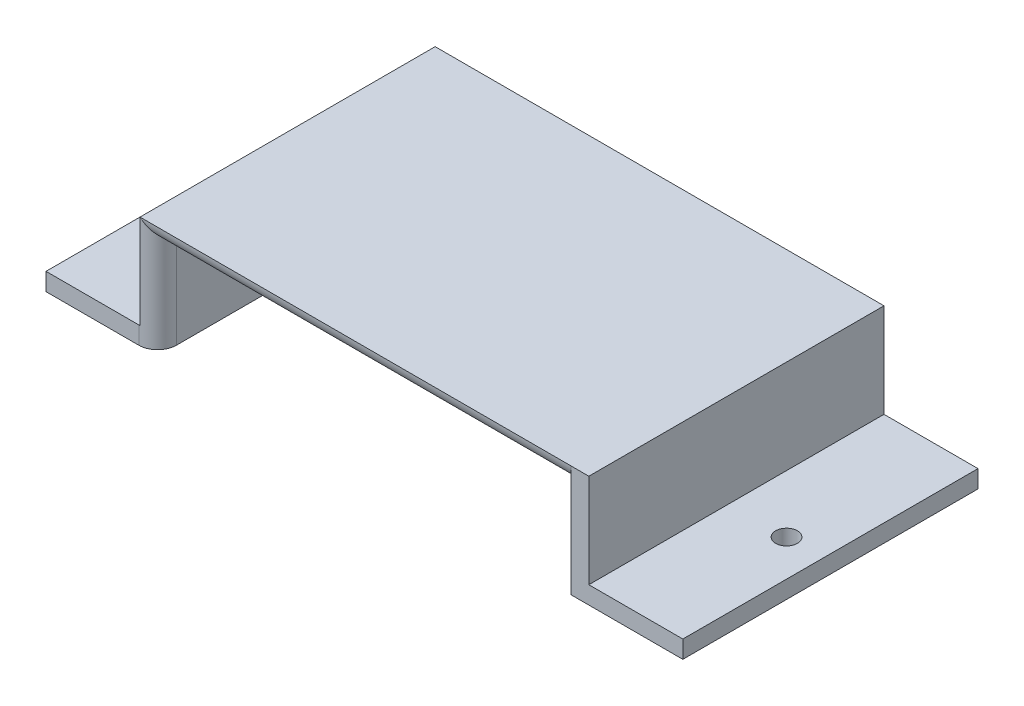
ISO-10303-21;
HEADER;
FILE_DESCRIPTION(('STEP AP214'),'2;1');
FILE_NAME('part.step','',(''),(''),'','','');
FILE_SCHEMA(('AUTOMOTIVE_DESIGN { 1 0 10303 214 1 1 1 1 }'));
ENDSEC;
DATA;
#1=APPLICATION_CONTEXT('core data for automotive mechanical design processes');
#2=APPLICATION_PROTOCOL_DEFINITION('international standard','automotive_design',2000,#1);
#3=PRODUCT_CONTEXT('',#1,'mechanical');
#4=PRODUCT('Part','Part','',(#3));
#5=PRODUCT_RELATED_PRODUCT_CATEGORY('part','',(#4));
#6=PRODUCT_DEFINITION_FORMATION('','',#4);
#7=PRODUCT_DEFINITION_CONTEXT('part definition',#1,'design');
#8=PRODUCT_DEFINITION('design','',#6,#7);
#9=PRODUCT_DEFINITION_SHAPE('','',#8);
#10=(LENGTH_UNIT() NAMED_UNIT(*) SI_UNIT(.MILLI.,.METRE.));
#11=(NAMED_UNIT(*) PLANE_ANGLE_UNIT() SI_UNIT($,.RADIAN.));
#12=(NAMED_UNIT(*) SI_UNIT($,.STERADIAN.) SOLID_ANGLE_UNIT());
#13=UNCERTAINTY_MEASURE_WITH_UNIT(LENGTH_MEASURE(1.E-05),#10,'distance_accuracy_value','');
#14=(GEOMETRIC_REPRESENTATION_CONTEXT(3) GLOBAL_UNCERTAINTY_ASSIGNED_CONTEXT((#13)) GLOBAL_UNIT_ASSIGNED_CONTEXT((#10,
#11,#12)) REPRESENTATION_CONTEXT('',''));
#15=CARTESIAN_POINT('',(0.,0.,0.));
#16=DIRECTION('',(0.,0.,1.));
#17=DIRECTION('',(1.,0.,0.));
#18=AXIS2_PLACEMENT_3D('',#15,#16,#17);
#19=CARTESIAN_POINT('',(0.,0.,39.878));
#20=DIRECTION('',(0.,0.,1.));
#21=DIRECTION('',(1.,0.,0.));
#22=AXIS2_PLACEMENT_3D('',#19,#20,#21);
#23=PLANE('',#22);
#24=DIRECTION('',(-1.,0.,0.));
#25=VECTOR('',#24,1.);
#26=CARTESIAN_POINT('',(-27.94,-2.38125,39.878));
#27=LINE('',#26,#25);
#28=CARTESIAN_POINT('',(-30.48,-2.38125,39.878));
#29=VERTEX_POINT('',#28);
#30=CARTESIAN_POINT('',(-43.02125,-2.38125,39.878));
#31=VERTEX_POINT('',#30);
#32=EDGE_CURVE('E156',#29,#31,#27,.T.);
#33=ORIENTED_EDGE('',*,*,#32,.F.);
#34=DIRECTION('',(0.,-1.,0.));
#35=VECTOR('',#34,1.);
#36=CARTESIAN_POINT('',(-30.48,0.,39.878));
#37=LINE('',#36,#35);
#38=CARTESIAN_POINT('',(-30.48,0.,39.878));
#39=VERTEX_POINT('',#38);
#40=EDGE_CURVE('E277',#29,#39,#37,.F.);
#41=ORIENTED_EDGE('',*,*,#40,.T.);
#42=DIRECTION('',(1.,0.,0.));
#43=VECTOR('',#42,1.);
#44=CARTESIAN_POINT('',(-43.02125,0.,39.878));
#45=LINE('',#44,#43);
#46=CARTESIAN_POINT('',(-43.02125,0.,39.878));
#47=VERTEX_POINT('',#46);
#48=EDGE_CURVE('E181',#47,#39,#45,.T.);
#49=ORIENTED_EDGE('',*,*,#48,.F.);
#50=DIRECTION('',(0.,1.,0.));
#51=VECTOR('',#50,1.);
#52=CARTESIAN_POINT('',(-43.02125,-2.38125,39.878));
#53=LINE('',#52,#51);
#54=EDGE_CURVE('E168',#31,#47,#53,.T.);
#55=ORIENTED_EDGE('',*,*,#54,.F.);
#56=EDGE_LOOP('',(#33,#41,#49,#55));
#57=FACE_BOUND('',#56,.T.);
#58=ADVANCED_FACE('F43',(#57),#23,.T.);
#59=CARTESIAN_POINT('',(27.94,-2.38125,39.878));
#60=DIRECTION('',(-1.,0.,0.));
#61=DIRECTION('',(0.,0.,1.));
#62=AXIS2_PLACEMENT_3D('',#59,#60,#61);
#63=PLANE('',#62);
#64=DIRECTION('',(0.,1.,0.));
#65=VECTOR('',#64,1.);
#66=CARTESIAN_POINT('',(27.94,-2.38125,0.));
#67=LINE('',#66,#65);
#68=CARTESIAN_POINT('',(27.94,-2.38125,0.));
#69=VERTEX_POINT('',#68);
#70=CARTESIAN_POINT('',(27.94,10.31875,0.));
#71=VERTEX_POINT('',#70);
#72=EDGE_CURVE('E205',#69,#71,#67,.T.);
#73=ORIENTED_EDGE('',*,*,#72,.F.);
#74=DIRECTION('',(0.,0.,-1.));
#75=VECTOR('',#74,1.);
#76=CARTESIAN_POINT('',(27.94,-2.38125,39.878));
#77=LINE('',#76,#75);
#78=CARTESIAN_POINT('',(27.94,-2.38125,39.878));
#79=VERTEX_POINT('',#78);
#80=EDGE_CURVE('E244',#79,#69,#77,.T.);
#81=ORIENTED_EDGE('',*,*,#80,.F.);
#82=DIRECTION('',(0.,1.,0.));
#83=VECTOR('',#82,1.);
#84=CARTESIAN_POINT('',(27.94,-2.38125,39.878));
#85=LINE('',#84,#83);
#86=CARTESIAN_POINT('',(27.94,12.7,39.878));
#87=VERTEX_POINT('',#86);
#88=EDGE_CURVE('E58',#79,#87,#85,.T.);
#89=ORIENTED_EDGE('',*,*,#88,.T.);
#90=CARTESIAN_POINT('',(27.94,12.85875,37.3429657916509));
#91=DIRECTION('',(-1.,0.,0.));
#92=DIRECTION('',(0.,0.,1.));
#93=AXIS2_PLACEMENT_3D('',#90,#91,#92);
#94=CIRCLE('',#93,2.54);
#95=CARTESIAN_POINT('',(27.94,10.31875,37.3429657916509));
#96=VERTEX_POINT('',#95);
#97=EDGE_CURVE('E11',#87,#96,#94,.F.);
#98=ORIENTED_EDGE('',*,*,#97,.T.);
#99=DIRECTION('',(0.,0.,-1.));
#100=VECTOR('',#99,1.);
#101=CARTESIAN_POINT('',(27.94,10.31875,39.878));
#102=LINE('',#101,#100);
#103=EDGE_CURVE('E204',#96,#71,#102,.T.);
#104=ORIENTED_EDGE('',*,*,#103,.T.);
#105=EDGE_LOOP('',(#73,#81,#89,#98,#104));
#106=FACE_BOUND('',#105,.T.);
#107=ADVANCED_FACE('F305',(#106),#63,.T.);
#108=CARTESIAN_POINT('',(43.02125,-2.38125,39.878));
#109=DIRECTION('',(0.,-1.,0.));
#110=DIRECTION('',(1.,0.,0.));
#111=AXIS2_PLACEMENT_3D('',#108,#109,#110);
#112=PLANE('',#111);
#113=CARTESIAN_POINT('',(38.1,-2.38125,20.9485790727513));
#114=DIRECTION('',(0.,1.,0.));
#115=DIRECTION('',(0.,0.,1.));
#116=AXIS2_PLACEMENT_3D('',#113,#114,#115);
#117=CIRCLE('',#116,1.4732);
#118=CARTESIAN_POINT('',(38.1,-2.38125,22.4217790727513));
#119=VERTEX_POINT('',#118);
#120=EDGE_CURVE('E527',#119,#119,#117,.T.);
#121=ORIENTED_EDGE('',*,*,#120,.T.);
#122=EDGE_LOOP('',(#121));
#123=FACE_BOUND('',#122,.T.);
#124=DIRECTION('',(-1.,0.,0.));
#125=VECTOR('',#124,1.);
#126=CARTESIAN_POINT('',(43.02125,-2.38125,0.));
#127=LINE('',#126,#125);
#128=CARTESIAN_POINT('',(43.02125,-2.38125,0.));
#129=VERTEX_POINT('',#128);
#130=EDGE_CURVE('E241',#129,#69,#127,.T.);
#131=ORIENTED_EDGE('',*,*,#130,.F.);
#132=DIRECTION('',(0.,0.,-1.));
#133=VECTOR('',#132,1.);
#134=CARTESIAN_POINT('',(43.02125,-2.38125,39.878));
#135=LINE('',#134,#133);
#136=CARTESIAN_POINT('',(43.02125,-2.38125,39.878));
#137=VERTEX_POINT('',#136);
#138=EDGE_CURVE('E248',#137,#129,#135,.T.);
#139=ORIENTED_EDGE('',*,*,#138,.F.);
#140=DIRECTION('',(-1.,0.,0.));
#141=VECTOR('',#140,1.);
#142=CARTESIAN_POINT('',(43.02125,-2.38125,39.878));
#143=LINE('',#142,#141);
#144=EDGE_CURVE('E201',#137,#79,#143,.T.);
#145=ORIENTED_EDGE('',*,*,#144,.T.);
#146=ORIENTED_EDGE('',*,*,#80,.T.);
#147=EDGE_LOOP('',(#131,#139,#145,#146));
#148=FACE_BOUND('',#147,.T.);
#149=ADVANCED_FACE('F308',(#123,#148),#112,.T.);
#150=CARTESIAN_POINT('',(43.02125,0.,39.878));
#151=DIRECTION('',(1.,0.,0.));
#152=DIRECTION('',(0.,0.,-1.));
#153=AXIS2_PLACEMENT_3D('',#150,#151,#152);
#154=PLANE('',#153);
#155=DIRECTION('',(0.,-1.,0.));
#156=VECTOR('',#155,1.);
#157=CARTESIAN_POINT('',(43.02125,0.,0.));
#158=LINE('',#157,#156);
#159=CARTESIAN_POINT('',(43.02125,0.,0.));
#160=VERTEX_POINT('',#159);
#161=EDGE_CURVE('E238',#160,#129,#158,.T.);
#162=ORIENTED_EDGE('',*,*,#161,.F.);
#163=DIRECTION('',(0.,0.,-1.));
#164=VECTOR('',#163,1.);
#165=CARTESIAN_POINT('',(43.02125,0.,39.878));
#166=LINE('',#165,#164);
#167=CARTESIAN_POINT('',(43.02125,0.,39.878));
#168=VERTEX_POINT('',#167);
#169=EDGE_CURVE('E250',#168,#160,#166,.T.);
#170=ORIENTED_EDGE('',*,*,#169,.F.);
#171=DIRECTION('',(0.,-1.,0.));
#172=VECTOR('',#171,1.);
#173=CARTESIAN_POINT('',(43.02125,0.,39.878));
#174=LINE('',#173,#172);
#175=EDGE_CURVE('E198',#168,#137,#174,.T.);
#176=ORIENTED_EDGE('',*,*,#175,.T.);
#177=ORIENTED_EDGE('',*,*,#138,.T.);
#178=EDGE_LOOP('',(#162,#170,#176,#177));
#179=FACE_BOUND('',#178,.T.);
#180=ADVANCED_FACE('F341',(#179),#154,.T.);
#181=CARTESIAN_POINT('',(30.32125,0.,39.878));
#182=DIRECTION('',(0.,1.,0.));
#183=DIRECTION('',(0.,0.,1.));
#184=AXIS2_PLACEMENT_3D('',#181,#182,#183);
#185=PLANE('',#184);
#186=CARTESIAN_POINT('',(38.1,0.,20.9485790727513));
#187=DIRECTION('',(0.,1.,0.));
#188=DIRECTION('',(0.,0.,1.));
#189=AXIS2_PLACEMENT_3D('',#186,#187,#188);
#190=CIRCLE('',#189,1.4732);
#191=CARTESIAN_POINT('',(38.1,0.,22.4217790727513));
#192=VERTEX_POINT('',#191);
#193=EDGE_CURVE('E530',#192,#192,#190,.T.);
#194=ORIENTED_EDGE('',*,*,#193,.F.);
#195=EDGE_LOOP('',(#194));
#196=FACE_BOUND('',#195,.T.);
#197=DIRECTION('',(1.,0.,0.));
#198=VECTOR('',#197,1.);
#199=CARTESIAN_POINT('',(30.32125,0.,0.));
#200=LINE('',#199,#198);
#201=CARTESIAN_POINT('',(30.32125,0.,0.));
#202=VERTEX_POINT('',#201);
#203=EDGE_CURVE('E235',#202,#160,#200,.T.);
#204=ORIENTED_EDGE('',*,*,#203,.F.);
#205=DIRECTION('',(0.,0.,-1.));
#206=VECTOR('',#205,1.);
#207=CARTESIAN_POINT('',(30.32125,0.,39.878));
#208=LINE('',#207,#206);
#209=CARTESIAN_POINT('',(30.32125,0.,39.878));
#210=VERTEX_POINT('',#209);
#211=EDGE_CURVE('E252',#210,#202,#208,.T.);
#212=ORIENTED_EDGE('',*,*,#211,.F.);
#213=DIRECTION('',(1.,0.,0.));
#214=VECTOR('',#213,1.);
#215=CARTESIAN_POINT('',(30.32125,0.,39.878));
#216=LINE('',#215,#214);
#217=EDGE_CURVE('E195',#210,#168,#216,.T.);
#218=ORIENTED_EDGE('',*,*,#217,.T.);
#219=ORIENTED_EDGE('',*,*,#169,.T.);
#220=EDGE_LOOP('',(#204,#212,#218,#219));
#221=FACE_BOUND('',#220,.T.);
#222=ADVANCED_FACE('F337',(#196,#221),#185,.T.);
#223=CARTESIAN_POINT('',(30.32125,12.7,39.878));
#224=DIRECTION('',(1.,0.,0.));
#225=DIRECTION('',(0.,1.,0.));
#226=AXIS2_PLACEMENT_3D('',#223,#224,#225);
#227=PLANE('',#226);
#228=DIRECTION('',(0.,-1.,0.));
#229=VECTOR('',#228,1.);
#230=CARTESIAN_POINT('',(30.32125,12.7,0.));
#231=LINE('',#230,#229);
#232=CARTESIAN_POINT('',(30.32125,12.7,0.));
#233=VERTEX_POINT('',#232);
#234=EDGE_CURVE('E232',#233,#202,#231,.T.);
#235=ORIENTED_EDGE('',*,*,#234,.F.);
#236=DIRECTION('',(0.,0.,-1.));
#237=VECTOR('',#236,1.);
#238=CARTESIAN_POINT('',(30.32125,12.7,39.878));
#239=LINE('',#238,#237);
#240=CARTESIAN_POINT('',(30.32125,12.7,39.878));
#241=VERTEX_POINT('',#240);
#242=EDGE_CURVE('E255',#241,#233,#239,.T.);
#243=ORIENTED_EDGE('',*,*,#242,.F.);
#244=DIRECTION('',(0.,-1.,0.));
#245=VECTOR('',#244,1.);
#246=CARTESIAN_POINT('',(30.32125,12.7,39.878));
#247=LINE('',#246,#245);
#248=EDGE_CURVE('E192',#241,#210,#247,.T.);
#249=ORIENTED_EDGE('',*,*,#248,.T.);
#250=ORIENTED_EDGE('',*,*,#211,.T.);
#251=EDGE_LOOP('',(#235,#243,#249,#250));
#252=FACE_BOUND('',#251,.T.);
#253=ADVANCED_FACE('F333',(#252),#227,.T.);
#254=CARTESIAN_POINT('',(-30.32125,12.7,39.878));
#255=DIRECTION('',(0.,1.,0.));
#256=DIRECTION('',(0.,0.,1.));
#257=AXIS2_PLACEMENT_3D('',#254,#255,#256);
#258=PLANE('',#257);
#259=DIRECTION('',(1.,0.,0.));
#260=VECTOR('',#259,1.);
#261=CARTESIAN_POINT('',(-30.32125,12.7,0.));
#262=LINE('',#261,#260);
#263=CARTESIAN_POINT('',(-30.32125,12.7,0.));
#264=VERTEX_POINT('',#263);
#265=EDGE_CURVE('E228',#264,#233,#262,.T.);
#266=ORIENTED_EDGE('',*,*,#265,.F.);
#267=DIRECTION('',(0.,0.,-1.));
#268=VECTOR('',#267,1.);
#269=CARTESIAN_POINT('',(-30.32125,12.7,39.878));
#270=LINE('',#269,#268);
#271=CARTESIAN_POINT('',(-30.32125,12.7,39.878));
#272=VERTEX_POINT('',#271);
#273=EDGE_CURVE('E258',#272,#264,#270,.T.);
#274=ORIENTED_EDGE('',*,*,#273,.F.);
#275=DIRECTION('',(1.,0.,0.));
#276=VECTOR('',#275,1.);
#277=CARTESIAN_POINT('',(-30.32125,12.7,39.878));
#278=LINE('',#277,#276);
#279=EDGE_CURVE('E188',#272,#87,#278,.T.);
#280=ORIENTED_EDGE('',*,*,#279,.T.);
#281=EDGE_CURVE('E184',#87,#241,#278,.T.);
#282=ORIENTED_EDGE('',*,*,#281,.T.);
#283=ORIENTED_EDGE('',*,*,#242,.T.);
#284=EDGE_LOOP('',(#266,#274,#280,#282,#283));
#285=FACE_BOUND('',#284,.T.);
#286=ADVANCED_FACE('F330',(#285),#258,.T.);
#287=CARTESIAN_POINT('',(-30.32125,0.,39.878));
#288=DIRECTION('',(-1.,0.,0.));
#289=DIRECTION('',(0.,-1.,0.));
#290=AXIS2_PLACEMENT_3D('',#287,#288,#289);
#291=PLANE('',#290);
#292=DIRECTION('',(0.,-1.,0.));
#293=VECTOR('',#292,1.);
#294=CARTESIAN_POINT('',(-30.32125,10.31875,39.8730342083491));
#295=LINE('',#294,#293);
#296=CARTESIAN_POINT('',(-30.32125,0.,39.8730342083491));
#297=VERTEX_POINT('',#296);
#298=CARTESIAN_POINT('',(-30.32125,12.6343534607518,39.8730342083491));
#299=VERTEX_POINT('',#298);
#300=EDGE_CURVE('E69',#297,#299,#295,.F.);
#301=ORIENTED_EDGE('',*,*,#300,.T.);
#302=CARTESIAN_POINT('',(-30.32125,12.85875,37.3429657916509));
#303=DIRECTION('',(-1.,0.,0.));
#304=DIRECTION('',(0.,-1.,0.));
#305=AXIS2_PLACEMENT_3D('',#302,#303,#304);
#306=CIRCLE('',#305,2.54);
#307=EDGE_CURVE('E292',#299,#272,#306,.T.);
#308=ORIENTED_EDGE('',*,*,#307,.T.);
#309=ORIENTED_EDGE('',*,*,#273,.T.);
#310=DIRECTION('',(0.,1.,0.));
#311=VECTOR('',#310,1.);
#312=CARTESIAN_POINT('',(-30.32125,0.,0.));
#313=LINE('',#312,#311);
#314=CARTESIAN_POINT('',(-30.32125,0.,0.));
#315=VERTEX_POINT('',#314);
#316=EDGE_CURVE('E224',#315,#264,#313,.T.);
#317=ORIENTED_EDGE('',*,*,#316,.F.);
#318=DIRECTION('',(0.,0.,-1.));
#319=VECTOR('',#318,1.);
#320=CARTESIAN_POINT('',(-30.32125,0.,39.878));
#321=LINE('',#320,#319);
#322=EDGE_CURVE('E261',#297,#315,#321,.T.);
#323=ORIENTED_EDGE('',*,*,#322,.F.);
#324=EDGE_LOOP('',(#301,#308,#309,#317,#323));
#325=FACE_BOUND('',#324,.T.);
#326=ADVANCED_FACE('F326',(#325),#291,.T.);
#327=CARTESIAN_POINT('',(-43.02125,0.,39.878));
#328=DIRECTION('',(0.,1.,0.));
#329=DIRECTION('',(0.,0.,1.));
#330=AXIS2_PLACEMENT_3D('',#327,#328,#329);
#331=PLANE('',#330);
#332=CARTESIAN_POINT('',(-38.1,0.,20.9485790727513));
#333=DIRECTION('',(0.,1.,0.));
#334=DIRECTION('',(0.,0.,1.));
#335=AXIS2_PLACEMENT_3D('',#332,#333,#334);
#336=CIRCLE('',#335,1.4732);
#337=CARTESIAN_POINT('',(-38.1,0.,22.4217790727513));
#338=VERTEX_POINT('',#337);
#339=EDGE_CURVE('E523',#338,#338,#336,.T.);
#340=ORIENTED_EDGE('',*,*,#339,.F.);
#341=EDGE_LOOP('',(#340));
#342=FACE_BOUND('',#341,.T.);
#343=ORIENTED_EDGE('',*,*,#48,.T.);
#344=CARTESIAN_POINT('',(-30.48,0.,37.338));
#345=DIRECTION('',(0.,1.,0.));
#346=DIRECTION('',(0.,0.,1.));
#347=AXIS2_PLACEMENT_3D('',#344,#345,#346);
#348=CIRCLE('',#347,2.54);
#349=EDGE_CURVE('E280',#39,#297,#348,.T.);
#350=ORIENTED_EDGE('',*,*,#349,.T.);
#351=ORIENTED_EDGE('',*,*,#322,.T.);
#352=DIRECTION('',(1.,0.,0.));
#353=VECTOR('',#352,1.);
#354=CARTESIAN_POINT('',(-43.02125,0.,0.));
#355=LINE('',#354,#353);
#356=CARTESIAN_POINT('',(-43.02125,0.,0.));
#357=VERTEX_POINT('',#356);
#358=EDGE_CURVE('E221',#357,#315,#355,.T.);
#359=ORIENTED_EDGE('',*,*,#358,.F.);
#360=DIRECTION('',(0.,0.,-1.));
#361=VECTOR('',#360,1.);
#362=CARTESIAN_POINT('',(-43.02125,0.,39.878));
#363=LINE('',#362,#361);
#364=EDGE_CURVE('E176',#47,#357,#363,.T.);
#365=ORIENTED_EDGE('',*,*,#364,.F.);
#366=EDGE_LOOP('',(#343,#350,#351,#359,#365));
#367=FACE_BOUND('',#366,.T.);
#368=ADVANCED_FACE('F323',(#342,#367),#331,.T.);
#369=CARTESIAN_POINT('',(-43.02125,-2.38125,39.878));
#370=DIRECTION('',(-1.,0.,0.));
#371=DIRECTION('',(0.,-1.,0.));
#372=AXIS2_PLACEMENT_3D('',#369,#370,#371);
#373=PLANE('',#372);
#374=DIRECTION('',(0.,1.,0.));
#375=VECTOR('',#374,1.);
#376=CARTESIAN_POINT('',(-43.02125,-2.38125,0.));
#377=LINE('',#376,#375);
#378=CARTESIAN_POINT('',(-43.02125,-2.38125,0.));
#379=VERTEX_POINT('',#378);
#380=EDGE_CURVE('E174',#379,#357,#377,.T.);
#381=ORIENTED_EDGE('',*,*,#380,.F.);
#382=DIRECTION('',(0.,0.,-1.));
#383=VECTOR('',#382,1.);
#384=CARTESIAN_POINT('',(-43.02125,-2.38125,39.878));
#385=LINE('',#384,#383);
#386=EDGE_CURVE('E161',#31,#379,#385,.T.);
#387=ORIENTED_EDGE('',*,*,#386,.F.);
#388=ORIENTED_EDGE('',*,*,#54,.T.);
#389=ORIENTED_EDGE('',*,*,#364,.T.);
#390=EDGE_LOOP('',(#381,#387,#388,#389));
#391=FACE_BOUND('',#390,.T.);
#392=ADVANCED_FACE('F172',(#391),#373,.T.);
#393=CARTESIAN_POINT('',(-27.94,-2.38125,39.878));
#394=DIRECTION('',(0.,-1.,0.));
#395=DIRECTION('',(1.,0.,0.));
#396=AXIS2_PLACEMENT_3D('',#393,#394,#395);
#397=PLANE('',#396);
#398=CARTESIAN_POINT('',(-38.1,-2.38125,20.9485790727513));
#399=DIRECTION('',(0.,1.,0.));
#400=DIRECTION('',(0.,0.,1.));
#401=AXIS2_PLACEMENT_3D('',#398,#399,#400);
#402=CIRCLE('',#401,1.4732);
#403=CARTESIAN_POINT('',(-38.1,-2.38125,22.4217790727513));
#404=VERTEX_POINT('',#403);
#405=EDGE_CURVE('E209',#404,#404,#402,.T.);
#406=ORIENTED_EDGE('',*,*,#405,.T.);
#407=EDGE_LOOP('',(#406));
#408=FACE_BOUND('',#407,.T.);
#409=DIRECTION('',(0.,0.,-1.));
#410=VECTOR('',#409,1.);
#411=CARTESIAN_POINT('',(-27.94,-2.38125,39.878));
#412=LINE('',#411,#410);
#413=CARTESIAN_POINT('',(-27.94,-2.38125,37.338));
#414=VERTEX_POINT('',#413);
#415=CARTESIAN_POINT('',(-27.94,-2.38125,0.));
#416=VERTEX_POINT('',#415);
#417=EDGE_CURVE('E177',#414,#416,#412,.T.);
#418=ORIENTED_EDGE('',*,*,#417,.F.);
#419=CARTESIAN_POINT('',(-30.48,-2.38125,37.338));
#420=DIRECTION('',(0.,-1.,0.));
#421=DIRECTION('',(1.,0.,0.));
#422=AXIS2_PLACEMENT_3D('',#419,#420,#421);
#423=CIRCLE('',#422,2.54);
#424=EDGE_CURVE('E163',#414,#29,#423,.T.);
#425=ORIENTED_EDGE('',*,*,#424,.T.);
#426=ORIENTED_EDGE('',*,*,#32,.T.);
#427=ORIENTED_EDGE('',*,*,#386,.T.);
#428=DIRECTION('',(-1.,0.,0.));
#429=VECTOR('',#428,1.);
#430=CARTESIAN_POINT('',(-27.94,-2.38125,0.));
#431=LINE('',#430,#429);
#432=EDGE_CURVE('E217',#416,#379,#431,.T.);
#433=ORIENTED_EDGE('',*,*,#432,.F.);
#434=EDGE_LOOP('',(#418,#425,#426,#427,#433));
#435=FACE_BOUND('',#434,.T.);
#436=ADVANCED_FACE('F159',(#408,#435),#397,.T.);
#437=CARTESIAN_POINT('',(-27.94,10.31875,39.878));
#438=DIRECTION('',(1.,0.,0.));
#439=DIRECTION('',(0.,1.,0.));
#440=AXIS2_PLACEMENT_3D('',#437,#438,#439);
#441=PLANE('',#440);
#442=DIRECTION('',(0.,0.,-1.));
#443=VECTOR('',#442,1.);
#444=CARTESIAN_POINT('',(-27.94,10.31875,39.878));
#445=LINE('',#444,#443);
#446=CARTESIAN_POINT('',(-27.94,10.31875,37.338));
#447=VERTEX_POINT('',#446);
#448=CARTESIAN_POINT('',(-27.94,10.31875,0.));
#449=VERTEX_POINT('',#448);
#450=EDGE_CURVE('E267',#447,#449,#445,.T.);
#451=ORIENTED_EDGE('',*,*,#450,.F.);
#452=DIRECTION('',(0.,-1.,0.));
#453=VECTOR('',#452,1.);
#454=CARTESIAN_POINT('',(-27.94,10.31875,37.338));
#455=LINE('',#454,#453);
#456=EDGE_CURVE('E247',#447,#414,#455,.T.);
#457=ORIENTED_EDGE('',*,*,#456,.T.);
#458=ORIENTED_EDGE('',*,*,#417,.T.);
#459=DIRECTION('',(0.,-1.,0.));
#460=VECTOR('',#459,1.);
#461=CARTESIAN_POINT('',(-27.94,10.31875,0.));
#462=LINE('',#461,#460);
#463=EDGE_CURVE('E213',#449,#416,#462,.T.);
#464=ORIENTED_EDGE('',*,*,#463,.F.);
#465=EDGE_LOOP('',(#451,#457,#458,#464));
#466=FACE_BOUND('',#465,.T.);
#467=ADVANCED_FACE('F313',(#466),#441,.T.);
#468=CARTESIAN_POINT('',(27.94,10.31875,39.878));
#469=DIRECTION('',(0.,-1.,0.));
#470=DIRECTION('',(1.,0.,0.));
#471=AXIS2_PLACEMENT_3D('',#468,#469,#470);
#472=PLANE('',#471);
#473=ORIENTED_EDGE('',*,*,#103,.F.);
#474=DIRECTION('',(1.,0.,0.));
#475=VECTOR('',#474,1.);
#476=CARTESIAN_POINT('',(-30.32125,10.31875,37.3429657916509));
#477=LINE('',#476,#475);
#478=CARTESIAN_POINT('',(-27.9400048541556,10.31875,37.3429657916509));
#479=VERTEX_POINT('',#478);
#480=EDGE_CURVE('E288',#96,#479,#477,.F.);
#481=ORIENTED_EDGE('',*,*,#480,.T.);
#482=CARTESIAN_POINT('',(-30.48,10.31875,37.338));
#483=DIRECTION('',(0.,-1.,0.));
#484=DIRECTION('',(1.,0.,0.));
#485=AXIS2_PLACEMENT_3D('',#482,#483,#484);
#486=CIRCLE('',#485,2.54);
#487=EDGE_CURVE('E285',#479,#447,#486,.F.);
#488=ORIENTED_EDGE('',*,*,#487,.T.);
#489=ORIENTED_EDGE('',*,*,#450,.T.);
#490=DIRECTION('',(-1.,0.,0.));
#491=VECTOR('',#490,1.);
#492=CARTESIAN_POINT('',(27.94,10.31875,0.));
#493=LINE('',#492,#491);
#494=EDGE_CURVE('E208',#71,#449,#493,.T.);
#495=ORIENTED_EDGE('',*,*,#494,.F.);
#496=EDGE_LOOP('',(#473,#481,#488,#489,#495));
#497=FACE_BOUND('',#496,.T.);
#498=ADVANCED_FACE('F309',(#497),#472,.T.);
#499=ORIENTED_EDGE('',*,*,#281,.F.);
#500=ORIENTED_EDGE('',*,*,#88,.F.);
#501=ORIENTED_EDGE('',*,*,#144,.F.);
#502=ORIENTED_EDGE('',*,*,#175,.F.);
#503=ORIENTED_EDGE('',*,*,#217,.F.);
#504=ORIENTED_EDGE('',*,*,#248,.F.);
#505=EDGE_LOOP('',(#499,#500,#501,#502,#503,#504));
#506=FACE_BOUND('',#505,.T.);
#507=ADVANCED_FACE('F312',(#506),#23,.T.);
#508=CARTESIAN_POINT('',(0.,0.,0.));
#509=DIRECTION('',(0.,0.,1.));
#510=DIRECTION('',(1.,0.,0.));
#511=AXIS2_PLACEMENT_3D('',#508,#509,#510);
#512=PLANE('',#511);
#513=ORIENTED_EDGE('',*,*,#72,.T.);
#514=ORIENTED_EDGE('',*,*,#494,.T.);
#515=ORIENTED_EDGE('',*,*,#463,.T.);
#516=ORIENTED_EDGE('',*,*,#432,.T.);
#517=ORIENTED_EDGE('',*,*,#380,.T.);
#518=ORIENTED_EDGE('',*,*,#358,.T.);
#519=ORIENTED_EDGE('',*,*,#316,.T.);
#520=ORIENTED_EDGE('',*,*,#265,.T.);
#521=ORIENTED_EDGE('',*,*,#234,.T.);
#522=ORIENTED_EDGE('',*,*,#203,.T.);
#523=ORIENTED_EDGE('',*,*,#161,.T.);
#524=ORIENTED_EDGE('',*,*,#130,.T.);
#525=EDGE_LOOP('',(#513,#514,#515,#516,#517,#518,#519,#520,#521,#522,#523,#524));
#526=FACE_BOUND('',#525,.T.);
#527=ADVANCED_FACE('F349',(#526),#512,.F.);
#528=CARTESIAN_POINT('',(-38.1,0.,20.9485790727513));
#529=DIRECTION('',(0.,1.,0.));
#530=DIRECTION('',(0.,0.,1.));
#531=AXIS2_PLACEMENT_3D('',#528,#529,#530);
#532=CYLINDRICAL_SURFACE('',#531,1.4732);
#533=ORIENTED_EDGE('',*,*,#405,.F.);
#534=EDGE_LOOP('',(#533));
#535=FACE_BOUND('',#534,.T.);
#536=ORIENTED_EDGE('',*,*,#339,.T.);
#537=EDGE_LOOP('',(#536));
#538=FACE_BOUND('',#537,.T.);
#539=ADVANCED_FACE('F352',(#535,#538),#532,.F.);
#540=CARTESIAN_POINT('',(38.1,0.,20.9485790727513));
#541=DIRECTION('',(0.,1.,0.));
#542=DIRECTION('',(0.,0.,1.));
#543=AXIS2_PLACEMENT_3D('',#540,#541,#542);
#544=CYLINDRICAL_SURFACE('',#543,1.4732);
#545=ORIENTED_EDGE('',*,*,#120,.F.);
#546=EDGE_LOOP('',(#545));
#547=FACE_BOUND('',#546,.T.);
#548=ORIENTED_EDGE('',*,*,#193,.T.);
#549=EDGE_LOOP('',(#548));
#550=FACE_BOUND('',#549,.T.);
#551=ADVANCED_FACE('F303',(#547,#550),#544,.F.);
#552=CARTESIAN_POINT('',(-30.48,10.31875,37.338));
#553=DIRECTION('',(0.,-1.,0.));
#554=DIRECTION('',(1.,0.,0.));
#555=AXIS2_PLACEMENT_3D('',#552,#553,#554);
#556=CYLINDRICAL_SURFACE('',#555,2.54);
#557=ORIENTED_EDGE('',*,*,#349,.F.);
#558=ORIENTED_EDGE('',*,*,#40,.F.);
#559=ORIENTED_EDGE('',*,*,#424,.F.);
#560=ORIENTED_EDGE('',*,*,#456,.F.);
#561=ORIENTED_EDGE('',*,*,#487,.F.);
#562=CARTESIAN_POINT('',(-27.9400048541556,10.31875,37.3429657916509));
#563=CARTESIAN_POINT('',(-27.9401020426881,10.3187357688532,37.3999594518168));
#564=CARTESIAN_POINT('',(-27.9421454657299,10.3206677808142,37.4569382338192));
#565=CARTESIAN_POINT('',(-27.9500140552008,10.3283131174702,37.5703350373761));
#566=CARTESIAN_POINT('',(-27.9558362455674,10.3340234665104,37.6267534647795));
#567=CARTESIAN_POINT('',(-27.971087241866,10.3490506802838,37.7381158807491));
#568=CARTESIAN_POINT('',(-27.9804850660669,10.3583365721639,37.7930683125435));
#569=CARTESIAN_POINT('',(-28.0026919627555,10.3803180073231,37.9015744683166));
#570=CARTESIAN_POINT('',(-28.0155015269299,10.393014042061,37.9551279894672));
#571=CARTESIAN_POINT('',(-28.0586256695001,10.4357949289528,38.1128340141333));
#572=CARTESIAN_POINT('',(-28.0936970351437,10.4706330593435,38.2144612290227));
#573=CARTESIAN_POINT('',(-28.17443128965,10.5508851885389,38.4090347104674));
#574=CARTESIAN_POINT('',(-28.2201179088383,10.5963228835188,38.5019608630006));
#575=CARTESIAN_POINT('',(-28.340410333699,10.7159863543964,38.7142665222231));
#576=CARTESIAN_POINT('',(-28.4192018442604,10.7943858510579,38.8289222013293));
#577=CARTESIAN_POINT('',(-28.5888006012588,10.963115799326,39.038960562181));
#578=CARTESIAN_POINT('',(-28.6796305240161,11.0534687666538,39.1343059911676));
#579=CARTESIAN_POINT('',(-28.8404839878107,11.2133851387755,39.2800282451121));
#580=CARTESIAN_POINT('',(-28.908346305879,11.280827016122,39.3352288126191));
#581=CARTESIAN_POINT('',(-29.0472872859201,11.4188118865441,39.4371332919316));
#582=CARTESIAN_POINT('',(-29.1183672194566,11.4893561053089,39.4838338073596));
#583=CARTESIAN_POINT('',(-29.263105769599,11.6328322011619,39.5691055872658));
#584=CARTESIAN_POINT('',(-29.3367672595548,11.7057667324832,39.6076674349746));
#585=CARTESIAN_POINT('',(-29.4860772787831,11.853290372243,39.6769078906895));
#586=CARTESIAN_POINT('',(-29.5617254800398,11.9278792072356,39.7075877911361));
#587=CARTESIAN_POINT('',(-29.69272163639,12.0564613741453,39.7536011617719));
#588=CARTESIAN_POINT('',(-29.7476573576544,12.1102147563924,39.7708112639511));
#589=CARTESIAN_POINT('',(-29.8583743874024,12.2179018397074,39.8014291266385));
#590=CARTESIAN_POINT('',(-29.9141553949274,12.2718354715046,39.8148382084543));
#591=CARTESIAN_POINT('',(-29.9985287159456,12.3523028829745,39.8321138782888));
#592=CARTESIAN_POINT('',(-30.0266967647562,12.3789850884256,39.8373894839453));
#593=CARTESIAN_POINT('',(-30.0834390656188,12.4320639918853,39.847016539439));
#594=CARTESIAN_POINT('',(-30.1120132032522,12.4584607667647,39.8513682442925));
#595=CARTESIAN_POINT('',(-30.1697768635352,12.510793546687,39.859155696968));
#596=CARTESIAN_POINT('',(-30.1989669586354,12.5367290777395,39.8625905482334));
#597=CARTESIAN_POINT('',(-30.2588079404267,12.5870183487389,39.8685226924084));
#598=CARTESIAN_POINT('',(-30.289460370729,12.6113703500959,39.8710189687462));
#599=CARTESIAN_POINT('',(-30.32125,12.6343534607518,39.8730342083491));
#600=B_SPLINE_CURVE_WITH_KNOTS('',3,(#562,#563,#564,#565,#566,#567,#568,#569,#570,#571,#572,
#573,#574,#575,#576,#577,#578,#579,#580,#581,#582,#583,#584,#585,#586,#587,#588,#589,#590,#591,
#592,#593,#594,#595,#596,#597,#598,#599),.UNSPECIFIED.,.F.,.F.,(4,2,2,2,2,2,2,2,2,2,2,2,2,2,2,2,
2,2,4),(0.,0.170897763982524,0.341661096226654,0.510977325284103,0.680317968751431,
1.01770350301602,1.35585064296451,1.83228952146018,2.30963895556225,2.64060400528215,
2.97170101022623,3.30317903276245,3.63460266653071,3.8708026479727,4.10692042078728,
4.22437649793962,4.34180011243115,4.4593381338622,4.57700309665147),.UNSPECIFIED.);
#601=EDGE_CURVE('E52',#479,#299,#600,.T.);
#602=ORIENTED_EDGE('',*,*,#601,.T.);
#603=ORIENTED_EDGE('',*,*,#300,.F.);
#604=EDGE_LOOP('',(#557,#558,#559,#560,#561,#602,#603));
#605=FACE_BOUND('',#604,.T.);
#606=ADVANCED_FACE('F299',(#605),#556,.T.);
#607=CARTESIAN_POINT('',(0.,12.85875,37.3429657916509));
#608=DIRECTION('',(-1.,0.,0.));
#609=DIRECTION('',(0.,0.,1.));
#610=AXIS2_PLACEMENT_3D('',#607,#608,#609);
#611=CYLINDRICAL_SURFACE('',#610,2.54);
#612=ORIENTED_EDGE('',*,*,#97,.F.);
#613=ORIENTED_EDGE('',*,*,#279,.F.);
#614=ORIENTED_EDGE('',*,*,#307,.F.);
#615=ORIENTED_EDGE('',*,*,#601,.F.);
#616=ORIENTED_EDGE('',*,*,#480,.F.);
#617=EDGE_LOOP('',(#612,#613,#614,#615,#616));
#618=FACE_BOUND('',#617,.T.);
#619=ADVANCED_FACE('F45',(#618),#611,.T.);
#620=CLOSED_SHELL('',(#58,#107,#149,#180,#222,#253,#286,#326,#368,#392,#436,#467,#498,#507,#527,
#539,#551,#606,#619));
#621=MANIFOLD_SOLID_BREP('B2',#620);
#622=ADVANCED_BREP_SHAPE_REPRESENTATION('',(#18,#621),#14);
#623=SHAPE_DEFINITION_REPRESENTATION(#9,#622);
ENDSEC;
END-ISO-10303-21;
